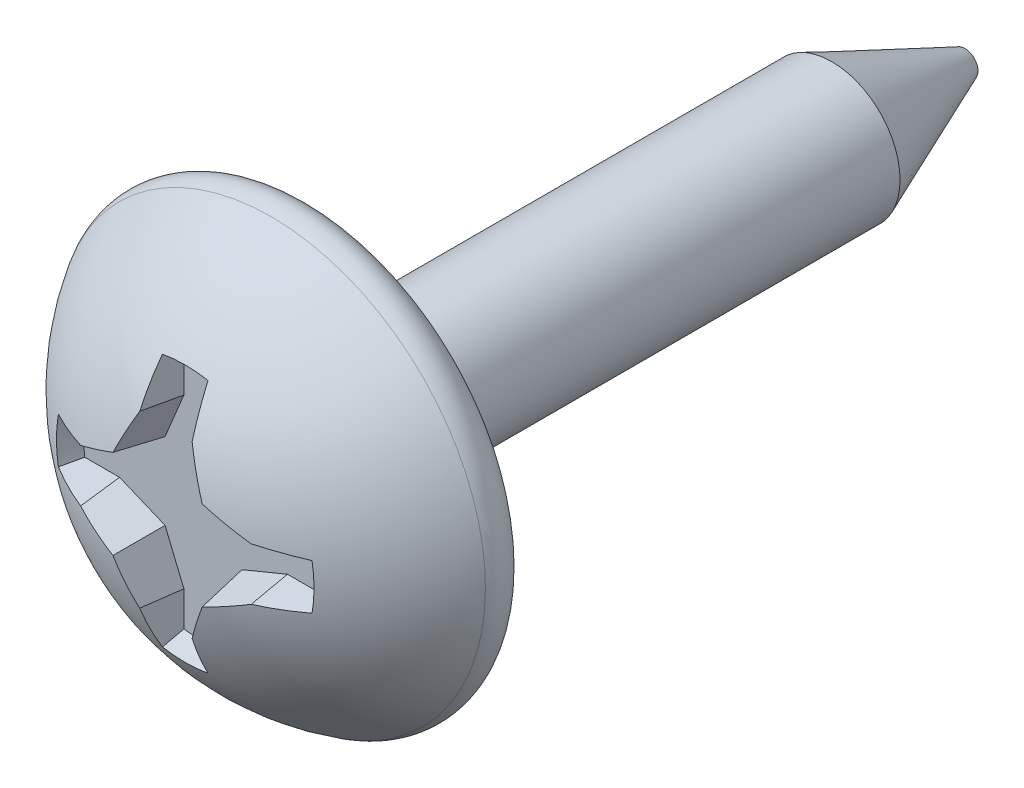
ISO-10303-21;
HEADER;
FILE_DESCRIPTION(('STEP AP214'),'2;1');
FILE_NAME('part.step','',(''),(''),'','','');
FILE_SCHEMA(('AUTOMOTIVE_DESIGN { 1 0 10303 214 1 1 1 1 }'));
ENDSEC;
DATA;
#1=APPLICATION_CONTEXT('core data for automotive mechanical design processes');
#2=APPLICATION_PROTOCOL_DEFINITION('international standard','automotive_design',2000,#1);
#3=PRODUCT_CONTEXT('',#1,'mechanical');
#4=PRODUCT('Part','Part','',(#3));
#5=PRODUCT_RELATED_PRODUCT_CATEGORY('part','',(#4));
#6=PRODUCT_DEFINITION_FORMATION('','',#4);
#7=PRODUCT_DEFINITION_CONTEXT('part definition',#1,'design');
#8=PRODUCT_DEFINITION('design','',#6,#7);
#9=PRODUCT_DEFINITION_SHAPE('','',#8);
#10=(LENGTH_UNIT() NAMED_UNIT(*) SI_UNIT(.MILLI.,.METRE.));
#11=(NAMED_UNIT(*) PLANE_ANGLE_UNIT() SI_UNIT($,.RADIAN.));
#12=(NAMED_UNIT(*) SI_UNIT($,.STERADIAN.) SOLID_ANGLE_UNIT());
#13=UNCERTAINTY_MEASURE_WITH_UNIT(LENGTH_MEASURE(1.E-05),#10,'distance_accuracy_value','');
#14=(GEOMETRIC_REPRESENTATION_CONTEXT(3) GLOBAL_UNCERTAINTY_ASSIGNED_CONTEXT((#13)) GLOBAL_UNIT_ASSIGNED_CONTEXT((#10,
#11,#12)) REPRESENTATION_CONTEXT('',''));
#15=CARTESIAN_POINT('',(0.,0.,0.));
#16=DIRECTION('',(0.,0.,1.));
#17=DIRECTION('',(1.,0.,0.));
#18=AXIS2_PLACEMENT_3D('',#15,#16,#17);
#19=CARTESIAN_POINT('',(0.,0.,0.));
#20=DIRECTION('',(0.,0.,-1.));
#21=DIRECTION('',(-1.,0.,0.));
#22=AXIS2_PLACEMENT_3D('',#19,#20,#21);
#23=CYLINDRICAL_SURFACE('',#22,0.662570209841312);
#24=CARTESIAN_POINT('',(0.,0.,0.));
#25=DIRECTION('',(0.,0.,-1.));
#26=DIRECTION('',(-1.,0.,0.));
#27=AXIS2_PLACEMENT_3D('',#24,#25,#26);
#28=CIRCLE('',#27,0.662570209841312);
#29=CARTESIAN_POINT('',(-0.662570209841312,0.,0.));
#30=VERTEX_POINT('',#29);
#31=EDGE_CURVE('E700',#30,#30,#28,.T.);
#32=ORIENTED_EDGE('',*,*,#31,.T.);
#33=EDGE_LOOP('',(#32));
#34=FACE_BOUND('',#33,.T.);
#35=CARTESIAN_POINT('',(0.,0.,-5.05701913579807));
#36=DIRECTION('',(0.,0.,1.));
#37=DIRECTION('',(1.,0.,0.));
#38=AXIS2_PLACEMENT_3D('',#35,#36,#37);
#39=CIRCLE('',#38,0.662570209841312);
#40=CARTESIAN_POINT('',(0.662570209841312,0.,-5.05701913579807));
#41=VERTEX_POINT('',#40);
#42=EDGE_CURVE('E696',#41,#41,#39,.T.);
#43=ORIENTED_EDGE('',*,*,#42,.T.);
#44=EDGE_LOOP('',(#43));
#45=FACE_BOUND('',#44,.T.);
#46=ADVANCED_FACE('F34',(#34,#45),#23,.T.);
#47=CARTESIAN_POINT('',(0.,0.,0.));
#48=DIRECTION('',(0.,0.,1.));
#49=DIRECTION('',(1.,0.,0.));
#50=AXIS2_PLACEMENT_3D('',#47,#48,#49);
#51=PLANE('',#50);
#52=ORIENTED_EDGE('',*,*,#31,.F.);
#53=EDGE_LOOP('',(#52));
#54=FACE_BOUND('',#53,.T.);
#55=CARTESIAN_POINT('',(0.,0.,0.));
#56=DIRECTION('',(0.,0.,-1.));
#57=DIRECTION('',(-1.,0.,0.));
#58=AXIS2_PLACEMENT_3D('',#55,#56,#57);
#59=CIRCLE('',#58,1.86081851094921);
#60=CARTESIAN_POINT('',(-1.86081851094921,0.,0.));
#61=VERTEX_POINT('',#60);
#62=EDGE_CURVE('E704',#61,#61,#59,.T.);
#63=ORIENTED_EDGE('',*,*,#62,.T.);
#64=EDGE_LOOP('',(#63));
#65=FACE_BOUND('',#64,.T.);
#66=ADVANCED_FACE('F269',(#54,#65),#51,.F.);
#67=CARTESIAN_POINT('',(0.,0.,0.260081489050793));
#68=DIRECTION('',(0.,0.,-1.));
#69=DIRECTION('',(-1.,0.,0.));
#70=AXIS2_PLACEMENT_3D('',#67,#68,#69);
#71=TOROIDAL_SURFACE('',#70,1.86081851094921,0.260081489050793);
#72=CARTESIAN_POINT('',(0.,0.,0.3937));
#73=DIRECTION('',(0.,0.,-1.));
#74=DIRECTION('',(-1.,0.,0.));
#75=AXIS2_PLACEMENT_3D('',#72,#73,#74);
#76=CIRCLE('',#75,2.08395182195094);
#77=CARTESIAN_POINT('',(-2.08395182195094,0.,0.3937));
#78=VERTEX_POINT('',#77);
#79=EDGE_CURVE('E391',#78,#78,#76,.T.);
#80=ORIENTED_EDGE('',*,*,#79,.T.);
#81=EDGE_LOOP('',(#80));
#82=FACE_BOUND('',#81,.T.);
#83=ORIENTED_EDGE('',*,*,#62,.F.);
#84=EDGE_LOOP('',(#83));
#85=FACE_BOUND('',#84,.T.);
#86=ADVANCED_FACE('F275',(#82,#85),#71,.T.);
#87=CARTESIAN_POINT('',(0.,0.,-0.854229043354766));
#88=DIRECTION('',(0.,0.,-1.));
#89=DIRECTION('',(0.,1.,0.));
#90=AXIS2_PLACEMENT_3D('',#87,#88,#89);
#91=SPHERICAL_SURFACE('',#90,2.42902904335477);
#92=CARTESIAN_POINT('',(0.141128825480216,0.,-0.829344223666908));
#93=DIRECTION('',(0.984807753012208,0.,0.173648177666931));
#94=DIRECTION('',(0.173648177666931,0.,-0.984807753012208));
#95=AXIS2_PLACEMENT_3D('',#92,#93,#94);
#96=CIRCLE('',#95,2.4247980315541);
#97=CARTESIAN_POINT('',(-0.254594202661198,0.828468542971583,1.41491259143554));
#98=VERTEX_POINT('',#97);
#99=CARTESIAN_POINT('',(-0.221519219927965,1.2321535141074,1.22733504317638));
#100=VERTEX_POINT('',#99);
#101=EDGE_CURVE('E11',#98,#100,#96,.F.);
#102=ORIENTED_EDGE('',*,*,#101,.T.);
#103=CARTESIAN_POINT('',(0.,0.,1.22733504317638));
#104=DIRECTION('',(0.,0.,-1.));
#105=DIRECTION('',(-1.,0.,0.));
#106=AXIS2_PLACEMENT_3D('',#103,#104,#105);
#107=CIRCLE('',#106,1.25190776302598);
#108=CARTESIAN_POINT('',(0.221519219927961,1.23215351410741,1.22733504317638));
#109=VERTEX_POINT('',#108);
#110=EDGE_CURVE('E488',#100,#109,#107,.T.);
#111=ORIENTED_EDGE('',*,*,#110,.T.);
#112=CARTESIAN_POINT('',(-0.141128825480217,0.,-0.829344223666908));
#113=DIRECTION('',(-0.984807753012208,0.,0.173648177666931));
#114=DIRECTION('',(0.173648177666931,0.,0.984807753012208));
#115=AXIS2_PLACEMENT_3D('',#112,#113,#114);
#116=CIRCLE('',#115,2.4247980315541);
#117=CARTESIAN_POINT('',(0.254594202661195,0.828468542971584,1.41491259143554));
#118=VERTEX_POINT('',#117);
#119=EDGE_CURVE('E53',#109,#118,#116,.F.);
#120=ORIENTED_EDGE('',*,*,#119,.T.);
#121=CARTESIAN_POINT('',(0.136324838861879,0.0564675971449169,-0.880247313471373));
#122=DIRECTION('',(-0.90984372646641,-0.376869611142463,0.173648177666931));
#123=DIRECTION('',(0.38268343236509,-0.923879532511287,0.));
#124=AXIS2_PLACEMENT_3D('',#121,#122,#123);
#125=CIRCLE('',#124,2.42440345072001);
#126=CARTESIAN_POINT('',(0.433636305459428,0.433636305459428,1.49611161336629));
#127=VERTEX_POINT('',#126);
#128=EDGE_CURVE('E487',#118,#127,#125,.F.);
#129=ORIENTED_EDGE('',*,*,#128,.T.);
#130=CARTESIAN_POINT('',(0.0564675971449167,0.136324838861878,-0.880247313471373));
#131=DIRECTION('',(-0.376869611142463,-0.90984372646641,0.173648177666931));
#132=DIRECTION('',(0.923879532511287,-0.382683432365089,0.));
#133=AXIS2_PLACEMENT_3D('',#130,#131,#132);
#134=CIRCLE('',#133,2.42440345072001);
#135=CARTESIAN_POINT('',(0.828468542971584,0.254594202661195,1.41491259143554));
#136=VERTEX_POINT('',#135);
#137=EDGE_CURVE('E485',#127,#136,#134,.F.);
#138=ORIENTED_EDGE('',*,*,#137,.T.);
#139=CARTESIAN_POINT('',(0.,-0.141128825480216,-0.829344223666908));
#140=DIRECTION('',(0.,-0.984807753012208,0.173648177666931));
#141=DIRECTION('',(0.,-0.173648177666931,-0.984807753012208));
#142=AXIS2_PLACEMENT_3D('',#139,#140,#141);
#143=CIRCLE('',#142,2.4247980315541);
#144=CARTESIAN_POINT('',(1.23215351410741,0.221519219927961,1.22733504317638));
#145=VERTEX_POINT('',#144);
#146=EDGE_CURVE('E390',#136,#145,#143,.F.);
#147=ORIENTED_EDGE('',*,*,#146,.T.);
#148=CARTESIAN_POINT('',(0.,0.,1.22733504317638));
#149=DIRECTION('',(0.,0.,-1.));
#150=DIRECTION('',(-1.,0.,0.));
#151=AXIS2_PLACEMENT_3D('',#148,#149,#150);
#152=CIRCLE('',#151,1.25190776302598);
#153=CARTESIAN_POINT('',(1.23215351410741,-0.221519219927948,1.22733504317638));
#154=VERTEX_POINT('',#153);
#155=EDGE_CURVE('E388',#145,#154,#152,.T.);
#156=ORIENTED_EDGE('',*,*,#155,.T.);
#157=CARTESIAN_POINT('',(0.,0.141128825480217,-0.829344223666908));
#158=DIRECTION('',(0.,0.984807753012208,0.173648177666931));
#159=DIRECTION('',(0.,-0.173648177666931,0.984807753012208));
#160=AXIS2_PLACEMENT_3D('',#157,#158,#159);
#161=CIRCLE('',#160,2.4247980315541);
#162=CARTESIAN_POINT('',(0.828468542971587,-0.254594202661186,1.41491259143554));
#163=VERTEX_POINT('',#162);
#164=EDGE_CURVE('E193',#154,#163,#161,.F.);
#165=ORIENTED_EDGE('',*,*,#164,.T.);
#166=CARTESIAN_POINT('',(0.0564675971449183,-0.136324838861878,-0.880247313471373));
#167=DIRECTION('',(-0.376869611142473,0.909843726466406,0.173648177666931));
#168=DIRECTION('',(-0.923879532511283,-0.3826834323651,0.));
#169=AXIS2_PLACEMENT_3D('',#166,#167,#168);
#170=CIRCLE('',#169,2.42440345072001);
#171=CARTESIAN_POINT('',(0.433636305459433,-0.433636305459424,1.49611161336629));
#172=VERTEX_POINT('',#171);
#173=EDGE_CURVE('E606',#163,#172,#170,.F.);
#174=ORIENTED_EDGE('',*,*,#173,.T.);
#175=CARTESIAN_POINT('',(0.136324838861879,-0.0564675971449154,-0.880247313471373));
#176=DIRECTION('',(-0.909843726466414,0.376869611142453,0.173648177666931));
#177=DIRECTION('',(-0.38268343236508,-0.923879532511291,0.));
#178=AXIS2_PLACEMENT_3D('',#175,#176,#177);
#179=CIRCLE('',#178,2.42440345072001);
#180=CARTESIAN_POINT('',(0.254594202661204,-0.828468542971582,1.41491259143554));
#181=VERTEX_POINT('',#180);
#182=EDGE_CURVE('E604',#172,#181,#179,.F.);
#183=ORIENTED_EDGE('',*,*,#182,.T.);
#184=CARTESIAN_POINT('',(-0.141128825480216,0.,-0.829344223666908));
#185=DIRECTION('',(-0.984807753012208,0.,0.173648177666931));
#186=DIRECTION('',(0.173648177666931,0.,0.984807753012208));
#187=AXIS2_PLACEMENT_3D('',#184,#185,#186);
#188=CIRCLE('',#187,2.4247980315541);
#189=CARTESIAN_POINT('',(0.221519219927974,-1.2321535141074,1.22733504317638));
#190=VERTEX_POINT('',#189);
#191=EDGE_CURVE('E215',#181,#190,#188,.F.);
#192=ORIENTED_EDGE('',*,*,#191,.T.);
#193=CARTESIAN_POINT('',(0.,0.,1.22733504317638));
#194=DIRECTION('',(0.,0.,-1.));
#195=DIRECTION('',(-1.,0.,0.));
#196=AXIS2_PLACEMENT_3D('',#193,#194,#195);
#197=CIRCLE('',#196,1.25190776302598);
#198=CARTESIAN_POINT('',(-0.221519219927952,-1.23215351410741,1.22733504317638));
#199=VERTEX_POINT('',#198);
#200=EDGE_CURVE('E371',#190,#199,#197,.T.);
#201=ORIENTED_EDGE('',*,*,#200,.T.);
#202=CARTESIAN_POINT('',(0.141128825480217,0.,-0.829344223666908));
#203=DIRECTION('',(0.984807753012208,0.,0.173648177666931));
#204=DIRECTION('',(0.173648177666931,0.,-0.984807753012208));
#205=AXIS2_PLACEMENT_3D('',#202,#203,#204);
#206=CIRCLE('',#205,2.4247980315541);
#207=CARTESIAN_POINT('',(-0.254594202661189,-0.828468542971586,1.41491259143554));
#208=VERTEX_POINT('',#207);
#209=EDGE_CURVE('E367',#199,#208,#206,.F.);
#210=ORIENTED_EDGE('',*,*,#209,.T.);
#211=CARTESIAN_POINT('',(-0.136324838861878,-0.0564675971449178,-0.880247313471373));
#212=DIRECTION('',(0.909843726466407,0.37686961114247,0.173648177666931));
#213=DIRECTION('',(-0.382683432365096,0.923879532511284,0.));
#214=AXIS2_PLACEMENT_3D('',#211,#212,#213);
#215=CIRCLE('',#214,2.42440345072001);
#216=CARTESIAN_POINT('',(-0.433636305459425,-0.433636305459431,1.49611161336629));
#217=VERTEX_POINT('',#216);
#218=EDGE_CURVE('E370',#208,#217,#215,.F.);
#219=ORIENTED_EDGE('',*,*,#218,.T.);
#220=CARTESIAN_POINT('',(-0.0564675971449158,-0.136324838861879,-0.880247313471373));
#221=DIRECTION('',(0.376869611142457,0.909843726466413,0.173648177666931));
#222=DIRECTION('',(-0.92387953251129,0.382683432365083,0.));
#223=AXIS2_PLACEMENT_3D('',#220,#221,#222);
#224=CIRCLE('',#223,2.42440345072001);
#225=CARTESIAN_POINT('',(-0.828468542971582,-0.254594202661201,1.41491259143554));
#226=VERTEX_POINT('',#225);
#227=EDGE_CURVE('E374',#217,#226,#224,.F.);
#228=ORIENTED_EDGE('',*,*,#227,.T.);
#229=CARTESIAN_POINT('',(0.,0.141128825480216,-0.829344223666908));
#230=DIRECTION('',(0.,0.984807753012208,0.173648177666931));
#231=DIRECTION('',(0.,-0.173648177666931,0.984807753012208));
#232=AXIS2_PLACEMENT_3D('',#229,#230,#231);
#233=CIRCLE('',#232,2.4247980315541);
#234=CARTESIAN_POINT('',(-1.2321535141074,-0.22151921992797,1.22733504317638));
#235=VERTEX_POINT('',#234);
#236=EDGE_CURVE('E376',#226,#235,#233,.F.);
#237=ORIENTED_EDGE('',*,*,#236,.T.);
#238=CARTESIAN_POINT('',(0.,0.,1.22733504317638));
#239=DIRECTION('',(0.,0.,-1.));
#240=DIRECTION('',(-1.,0.,0.));
#241=AXIS2_PLACEMENT_3D('',#238,#239,#240);
#242=CIRCLE('',#241,1.25190776302598);
#243=CARTESIAN_POINT('',(-1.23215351410741,0.221519219927956,1.22733504317638));
#244=VERTEX_POINT('',#243);
#245=EDGE_CURVE('E378',#235,#244,#242,.T.);
#246=ORIENTED_EDGE('',*,*,#245,.T.);
#247=CARTESIAN_POINT('',(0.,-0.141128825480217,-0.829344223666908));
#248=DIRECTION('',(0.,-0.984807753012208,0.173648177666931));
#249=DIRECTION('',(0.,-0.173648177666931,-0.984807753012208));
#250=AXIS2_PLACEMENT_3D('',#247,#248,#249);
#251=CIRCLE('',#250,2.4247980315541);
#252=CARTESIAN_POINT('',(-0.828468542971585,0.254594202661192,1.41491259143554));
#253=VERTEX_POINT('',#252);
#254=EDGE_CURVE('E318',#244,#253,#251,.F.);
#255=ORIENTED_EDGE('',*,*,#254,.T.);
#256=CARTESIAN_POINT('',(-0.0564675971449173,0.136324838861878,-0.880247313471373));
#257=DIRECTION('',(0.376869611142467,-0.909843726466408,0.173648177666931));
#258=DIRECTION('',(0.923879532511285,0.382683432365093,0.));
#259=AXIS2_PLACEMENT_3D('',#256,#257,#258);
#260=CIRCLE('',#259,2.42440345072001);
#261=CARTESIAN_POINT('',(-0.43363630545943,0.433636305459427,1.49611161336629));
#262=VERTEX_POINT('',#261);
#263=EDGE_CURVE('E382',#253,#262,#260,.F.);
#264=ORIENTED_EDGE('',*,*,#263,.T.);
#265=CARTESIAN_POINT('',(-0.136324838861879,0.0564675971449163,-0.880247313471373));
#266=DIRECTION('',(0.909843726466411,-0.37686961114246,0.173648177666931));
#267=DIRECTION('',(0.382683432365086,0.923879532511288,0.));
#268=AXIS2_PLACEMENT_3D('',#265,#266,#267);
#269=CIRCLE('',#268,2.42440345072001);
#270=EDGE_CURVE('E44',#262,#98,#269,.F.);
#271=ORIENTED_EDGE('',*,*,#270,.T.);
#272=EDGE_LOOP('',(#102,#111,#120,#129,#138,#147,#156,#165,#174,#183,#192,#201,#210,#219,#228,
#237,#246,#255,#264,#271));
#273=FACE_BOUND('',#272,.T.);
#274=ORIENTED_EDGE('',*,*,#79,.F.);
#275=EDGE_LOOP('',(#274));
#276=FACE_BOUND('',#275,.T.);
#277=ADVANCED_FACE('F284',(#273,#276),#91,.T.);
#278=CARTESIAN_POINT('',(0.,0.,-4.01980106959744));
#279=DIRECTION('',(0.,0.,1.));
#280=DIRECTION('',(1.,0.,0.));
#281=AXIS2_PLACEMENT_3D('',#278,#279,#280);
#282=CONICAL_SURFACE('',#281,1.0922,0.392699081698718);
#283=CARTESIAN_POINT('',(0.,0.,-6.34999999999999));
#284=DIRECTION('',(0.,0.,1.));
#285=DIRECTION('',(1.,0.,0.));
#286=AXIS2_PLACEMENT_3D('',#283,#284,#285);
#287=CIRCLE('',#286,0.127);
#288=CARTESIAN_POINT('',(0.127,0.,-6.35));
#289=VERTEX_POINT('',#288);
#290=EDGE_CURVE('E411',#289,#289,#287,.T.);
#291=CARTESIAN_POINT('',(0.662570209841312,0.,-5.05701913579807));
#292=CARTESIAN_POINT('',(0.656991353488798,0.,-5.07048768646684));
#293=CARTESIAN_POINT('',(0.651412497136284,0.,-5.08395623713561));
#294=CARTESIAN_POINT('',(0.640254784431257,0.,-5.11089333847315));
#295=CARTESIAN_POINT('',(0.634675928078744,0.,-5.12436188914192));
#296=CARTESIAN_POINT('',(0.623518215373716,0.,-5.15129899047946));
#297=CARTESIAN_POINT('',(0.617939359021203,0.,-5.16476754114823));
#298=CARTESIAN_POINT('',(0.606781646316175,0.,-5.19170464248577));
#299=CARTESIAN_POINT('',(0.601202789963661,0.,-5.20517319315454));
#300=CARTESIAN_POINT('',(0.590045077258634,0.,-5.23211029449208));
#301=CARTESIAN_POINT('',(0.584466220906121,0.,-5.24557884516085));
#302=CARTESIAN_POINT('',(0.573308508201093,0.,-5.27251594649839));
#303=CARTESIAN_POINT('',(0.56772965184858,0.,-5.28598449716716));
#304=CARTESIAN_POINT('',(0.556571939143552,0.,-5.3129215985047));
#305=CARTESIAN_POINT('',(0.550993082791039,0.,-5.32639014917347));
#306=CARTESIAN_POINT('',(0.539835370086011,0.,-5.35332725051101));
#307=CARTESIAN_POINT('',(0.534256513733498,0.,-5.36679580117978));
#308=CARTESIAN_POINT('',(0.52309880102847,0.,-5.39373290251732));
#309=CARTESIAN_POINT('',(0.517519944675957,0.,-5.40720145318609));
#310=CARTESIAN_POINT('',(0.506362231970929,0.,-5.43413855452363));
#311=CARTESIAN_POINT('',(0.500783375618416,0.,-5.4476071051924));
#312=CARTESIAN_POINT('',(0.489625662913388,0.,-5.47454420652994));
#313=CARTESIAN_POINT('',(0.484046806560874,0.,-5.48801275719871));
#314=CARTESIAN_POINT('',(0.472889093855847,0.,-5.51494985853625));
#315=CARTESIAN_POINT('',(0.467310237503334,0.,-5.52841840920502));
#316=CARTESIAN_POINT('',(0.456152524798306,0.,-5.55535551054256));
#317=CARTESIAN_POINT('',(0.450573668445793,0.,-5.56882406121133));
#318=CARTESIAN_POINT('',(0.439415955740765,0.,-5.59576116254887));
#319=CARTESIAN_POINT('',(0.433837099388252,0.,-5.60922971321764));
#320=CARTESIAN_POINT('',(0.422679386683224,0.,-5.63616681455518));
#321=CARTESIAN_POINT('',(0.417100530330711,0.,-5.64963536522395));
#322=CARTESIAN_POINT('',(0.405942817625683,0.,-5.67657246656149));
#323=CARTESIAN_POINT('',(0.40036396127317,0.,-5.69004101723026));
#324=CARTESIAN_POINT('',(0.389206248568142,0.,-5.7169781185678));
#325=CARTESIAN_POINT('',(0.383627392215629,0.,-5.73044666923657));
#326=CARTESIAN_POINT('',(0.372469679510601,0.,-5.75738377057411));
#327=CARTESIAN_POINT('',(0.366890823158088,0.,-5.77085232124288));
#328=CARTESIAN_POINT('',(0.35573311045306,0.,-5.79778942258042));
#329=CARTESIAN_POINT('',(0.350154254100546,0.,-5.81125797324919));
#330=CARTESIAN_POINT('',(0.338996541395519,0.,-5.83819507458673));
#331=CARTESIAN_POINT('',(0.333417685043006,0.,-5.8516636252555));
#332=CARTESIAN_POINT('',(0.322259972337978,0.,-5.87860072659304));
#333=CARTESIAN_POINT('',(0.316681115985465,0.,-5.89206927726181));
#334=CARTESIAN_POINT('',(0.305523403280437,0.,-5.91900637859935));
#335=CARTESIAN_POINT('',(0.299944546927924,0.,-5.93247492926812));
#336=CARTESIAN_POINT('',(0.288786834222896,0.,-5.95941203060566));
#337=CARTESIAN_POINT('',(0.283207977870383,0.,-5.97288058127443));
#338=CARTESIAN_POINT('',(0.272050265165355,0.,-5.99981768261198));
#339=CARTESIAN_POINT('',(0.266471408812841,0.,-6.01328623328074));
#340=CARTESIAN_POINT('',(0.255313696107814,0.,-6.04022333461828));
#341=CARTESIAN_POINT('',(0.249734839755301,0.,-6.05369188528705));
#342=CARTESIAN_POINT('',(0.238577127050273,0.,-6.08062898662459));
#343=CARTESIAN_POINT('',(0.232998270697759,0.,-6.09409753729336));
#344=CARTESIAN_POINT('',(0.221840557992732,0.,-6.1210346386309));
#345=CARTESIAN_POINT('',(0.216261701640219,0.,-6.13450318929967));
#346=CARTESIAN_POINT('',(0.205103988935191,0.,-6.16144029063721));
#347=CARTESIAN_POINT('',(0.199525132582678,0.,-6.17490884130599));
#348=CARTESIAN_POINT('',(0.18836741987765,0.,-6.20184594264352));
#349=CARTESIAN_POINT('',(0.182788563525136,0.,-6.2153144933123));
#350=CARTESIAN_POINT('',(0.171630850820109,0.,-6.24225159464984));
#351=CARTESIAN_POINT('',(0.166051994467595,0.,-6.25572014531861));
#352=CARTESIAN_POINT('',(0.154894281762568,0.,-6.28265724665615));
#353=CARTESIAN_POINT('',(0.149315425410055,0.,-6.29612579732491));
#354=CARTESIAN_POINT('',(0.138157712705027,0.,-6.32306289866245));
#355=CARTESIAN_POINT('',(0.132578856352514,0.,-6.33653144933123));
#356=CARTESIAN_POINT('',(0.127,0.,-6.35));
#357=B_SPLINE_CURVE_WITH_KNOTS('',3,(#291,#292,#293,#294,#295,#296,#297,#298,#299,#300,#301,
#302,#303,#304,#305,#306,#307,#308,#309,#310,#311,#312,#313,#314,#315,#316,#317,#318,#319,#320,
#321,#322,#323,#324,#325,#326,#327,#328,#329,#330,#331,#332,#333,#334,#335,#336,#337,#338,#339,
#340,#341,#342,#343,#344,#345,#346,#347,#348,#349,#350,#351,#352,#353,#354,#355,#356),
.UNSPECIFIED.,.F.,.F.,(4,2,2,2,2,2,2,2,2,2,2,2,2,2,2,2,2,2,2,2,2,2,2,2,2,2,2,2,2,2,2,2,4),(0.,
0.0437347625793582,0.087469525158717,0.131204287738076,0.174939050317434,0.218673812896793,
0.262408575476152,0.306143338055511,0.34987810063487,0.393612863214228,0.437347625793587,
0.481082388372945,0.524817150952304,0.568551913531662,0.612286676111021,0.65602143869038,
0.699756201269738,0.743490963849097,0.787225726428456,0.830960489007814,0.874695251587173,
0.918430014166532,0.962164776745891,1.00589953932525,1.04963430190461,1.09336906448397,
1.13710382706332,1.18083858964268,1.22457335222204,1.2683081148014,1.31204287738076,
1.35577763996012,1.39951240253948),.UNSPECIFIED.);
#358=EDGE_CURVE('BSEAM287',#41,#289,#357,.T.);
#359=ORIENTED_EDGE('',*,*,#42,.F.);
#360=ORIENTED_EDGE('',*,*,#290,.T.);
#361=ORIENTED_EDGE('',*,*,#358,.T.);
#362=ORIENTED_EDGE('',*,*,#358,.F.);
#363=EDGE_LOOP('',(#359,#361,#360,#362));
#364=FACE_BOUND('',#363,.T.);
#365=ADVANCED_FACE('F287',(#364),#282,.T.);
#366=CARTESIAN_POINT('',(0.,0.,-6.34999999999999));
#367=DIRECTION('',(0.,0.,-1.));
#368=DIRECTION('',(-1.,0.,0.));
#369=AXIS2_PLACEMENT_3D('',#366,#367,#368);
#370=PLANE('',#369);
#371=ORIENTED_EDGE('',*,*,#290,.F.);
#372=EDGE_LOOP('',(#371));
#373=FACE_BOUND('',#372,.T.);
#374=ADVANCED_FACE('F282',(#373),#370,.T.);
#375=CARTESIAN_POINT('',(0.,0.,1.5748));
#376=DIRECTION('',(0.,0.,1.));
#377=DIRECTION('',(1.,0.,0.));
#378=AXIS2_PLACEMENT_3D('',#375,#376,#377);
#379=CONICAL_SURFACE('',#378,1.41393333333333,0.436332312998583);
#380=ORIENTED_EDGE('',*,*,#110,.F.);
#381=CARTESIAN_POINT('',(-0.0567655589097211,0.814230108589913,0.292970600728164));
#382=CARTESIAN_POINT('',(-0.0704563797187253,0.849560680091315,0.370615103877912));
#383=CARTESIAN_POINT('',(-0.0841608874473927,0.884714488239667,0.448337229406313));
#384=CARTESIAN_POINT('',(-0.111590793644833,0.954749429859741,0.603899957737671));
#385=CARTESIAN_POINT('',(-0.125316191970339,0.989630565191458,0.681740559728125));
#386=CARTESIAN_POINT('',(-0.152781531160089,1.05920136114441,0.837504238544587));
#387=CARTESIAN_POINT('',(-0.166521471968835,1.09389102249324,0.915427315055852));
#388=CARTESIAN_POINT('',(-0.194012697128111,1.16312244787804,1.07133780050067));
#389=CARTESIAN_POINT('',(-0.207763981554202,1.19766421091919,1.14932520986275));
#390=CARTESIAN_POINT('',(-0.221519219927964,1.23215351410742,1.22733504317637));
#391=B_SPLINE_CURVE_WITH_KNOTS('',3,(#381,#382,#383,#384,#385,#386,#387,#388,#389,#390),
.UNSPECIFIED.,.F.,.F.,(4,2,2,2,4),(0.,0.259188802144362,0.518375834725883,0.777561881728411,
1.03674966936922),.UNSPECIFIED.);
#392=CARTESIAN_POINT('',(-0.190226756926774,1.15357370136408,1.04986666666667));
#393=VERTEX_POINT('',#392);
#394=EDGE_CURVE('E330',#393,#100,#391,.T.);
#395=ORIENTED_EDGE('',*,*,#394,.F.);
#396=CARTESIAN_POINT('',(0.,0.,1.04986666666667));
#397=DIRECTION('',(0.,0.,1.));
#398=DIRECTION('',(1.,0.,0.));
#399=AXIS2_PLACEMENT_3D('',#396,#397,#398);
#400=CIRCLE('',#399,1.16915289997917);
#401=CARTESIAN_POINT('',(0.19022675692677,1.15357370136408,1.04986666666667));
#402=VERTEX_POINT('',#401);
#403=EDGE_CURVE('E385',#402,#393,#400,.T.);
#404=ORIENTED_EDGE('',*,*,#403,.F.);
#405=CARTESIAN_POINT('',(0.0990141708359296,0.922637835089648,0.532574385449372));
#406=CARTESIAN_POINT('',(0.116954052360132,0.968415073311771,0.634316509383676));
#407=CARTESIAN_POINT('',(0.134909635736079,1.01398728041228,0.736147682944313));
#408=CARTESIAN_POINT('',(0.170844206107649,1.10482344058561,0.939942758588369));
#409=CARTESIAN_POINT('',(0.188823192990387,1.15008739513874,1.04190666003159));
#410=CARTESIAN_POINT('',(0.224796691352881,1.24040916710332,1.24592250728285));
#411=CARTESIAN_POINT('',(0.242791202788023,1.28546698510482,1.34797445283787));
#412=CARTESIAN_POINT('',(0.278792044422402,1.37542713542571,1.55214537148986));
#413=CARTESIAN_POINT('',(0.296798374676748,1.42032946701388,1.65426434489937));
#414=CARTESIAN_POINT('',(0.314808651172271,1.46517910460196,1.75640569855471));
#415=B_SPLINE_CURVE_WITH_KNOTS('',3,(#405,#406,#407,#408,#409,#410,#411,#412,#413,#414),
.UNSPECIFIED.,.F.,.F.,(4,2,2,2,4),(0.,0.338997296699866,0.677992964293807,1.01698766095126,
1.35598394969396),.UNSPECIFIED.);
#416=EDGE_CURVE('E399',#402,#109,#415,.T.);
#417=ORIENTED_EDGE('',*,*,#416,.T.);
#418=EDGE_LOOP('',(#380,#395,#404,#417));
#419=FACE_BOUND('',#418,.T.);
#420=ADVANCED_FACE('F296',(#419),#379,.F.);
#421=CARTESIAN_POINT('',(0.282786666666667,0.,1.5748));
#422=DIRECTION('',(-0.984807753012208,0.,0.173648177666931));
#423=DIRECTION('',(0.173648177666931,0.,0.984807753012208));
#424=AXIS2_PLACEMENT_3D('',#421,#422,#423);
#425=PLANE('',#424);
#426=ORIENTED_EDGE('',*,*,#416,.F.);
#427=DIRECTION('',(0.,-1.,0.));
#428=VECTOR('',#427,1.);
#429=CARTESIAN_POINT('',(0.19022675692677,0.,1.04986666666667));
#430=LINE('',#429,#428);
#431=CARTESIAN_POINT('',(0.19022675692677,0.815665061958368,1.04986666666667));
#432=VERTEX_POINT('',#431);
#433=EDGE_CURVE('E422',#432,#402,#430,.F.);
#434=ORIENTED_EDGE('',*,*,#433,.F.);
#435=DIRECTION('',(0.173544683499998,0.0345201838411381,0.984220808424847));
#436=VECTOR('',#435,1.);
#437=CARTESIAN_POINT('',(0.277789886621204,0.83308245138106,1.54646185217154));
#438=LINE('',#437,#436);
#439=EDGE_CURVE('E397',#432,#118,#438,.T.);
#440=ORIENTED_EDGE('',*,*,#439,.T.);
#441=ORIENTED_EDGE('',*,*,#119,.F.);
#442=EDGE_LOOP('',(#426,#434,#440,#441));
#443=FACE_BOUND('',#442,.T.);
#444=ADVANCED_FACE('F234',(#443),#425,.T.);
#445=CARTESIAN_POINT('',(0.536264047740044,0.222127841587019,1.5748));
#446=DIRECTION('',(-0.90984372646641,-0.376869611142463,0.173648177666931));
#447=DIRECTION('',(0.38268343236509,-0.923879532511287,0.));
#448=AXIS2_PLACEMENT_3D('',#445,#446,#447);
#449=PLANE('',#448);
#450=ORIENTED_EDGE('',*,*,#439,.F.);
#451=DIRECTION('',(0.38268343236509,-0.923879532511287,0.));
#452=VECTOR('',#451,1.);
#453=CARTESIAN_POINT('',(0.45074984160026,0.186706697628353,1.04986666666667));
#454=LINE('',#453,#452);
#455=CARTESIAN_POINT('',(0.373413395256704,0.373413395256705,1.04986666666667));
#456=VERTEX_POINT('',#455);
#457=EDGE_CURVE('E429',#456,#432,#454,.F.);
#458=ORIENTED_EDGE('',*,*,#457,.F.);
#459=DIRECTION('',(0.132562095018009,0.132562095018009,0.982270116581418));
#460=VECTOR('',#459,1.);
#461=CARTESIAN_POINT('',(0.441969131464488,0.441969131464488,1.55785691069529));
#462=LINE('',#461,#460);
#463=EDGE_CURVE('E400',#456,#127,#462,.T.);
#464=ORIENTED_EDGE('',*,*,#463,.T.);
#465=ORIENTED_EDGE('',*,*,#128,.F.);
#466=EDGE_LOOP('',(#450,#458,#464,#465));
#467=FACE_BOUND('',#466,.T.);
#468=ADVANCED_FACE('F230',(#467),#449,.T.);
#469=CARTESIAN_POINT('',(0.222127841587019,0.536264047740044,1.5748));
#470=DIRECTION('',(-0.376869611142463,-0.90984372646641,0.173648177666931));
#471=DIRECTION('',(0.923879532511287,-0.382683432365089,0.));
#472=AXIS2_PLACEMENT_3D('',#469,#470,#471);
#473=PLANE('',#472);
#474=ORIENTED_EDGE('',*,*,#463,.F.);
#475=DIRECTION('',(0.923879532511287,-0.382683432365089,0.));
#476=VECTOR('',#475,1.);
#477=CARTESIAN_POINT('',(0.186706697628352,0.450749841600261,1.04986666666667));
#478=LINE('',#477,#476);
#479=CARTESIAN_POINT('',(0.815665061958368,0.19022675692677,1.04986666666667));
#480=VERTEX_POINT('',#479);
#481=EDGE_CURVE('E431',#480,#456,#478,.F.);
#482=ORIENTED_EDGE('',*,*,#481,.F.);
#483=DIRECTION('',(0.0345201838411381,0.173544683499998,0.984220808424847));
#484=VECTOR('',#483,1.);
#485=CARTESIAN_POINT('',(0.834865679358879,0.286754779057557,1.59730428366066));
#486=LINE('',#485,#484);
#487=EDGE_CURVE('E403',#480,#136,#486,.T.);
#488=ORIENTED_EDGE('',*,*,#487,.T.);
#489=ORIENTED_EDGE('',*,*,#137,.F.);
#490=EDGE_LOOP('',(#474,#482,#488,#489));
#491=FACE_BOUND('',#490,.T.);
#492=ADVANCED_FACE('F233',(#491),#473,.T.);
#493=CARTESIAN_POINT('',(0.,0.282786666666667,1.5748));
#494=DIRECTION('',(0.,-0.984807753012208,0.173648177666931));
#495=DIRECTION('',(0.,-0.173648177666931,-0.984807753012208));
#496=AXIS2_PLACEMENT_3D('',#493,#494,#495);
#497=PLANE('',#496);
#498=ORIENTED_EDGE('',*,*,#487,.F.);
#499=DIRECTION('',(1.,0.,0.));
#500=VECTOR('',#499,1.);
#501=CARTESIAN_POINT('',(0.,0.19022675692677,1.04986666666667));
#502=LINE('',#501,#500);
#503=CARTESIAN_POINT('',(1.15357370136408,0.19022675692677,1.04986666666667));
#504=VERTEX_POINT('',#503);
#505=EDGE_CURVE('E185',#504,#480,#502,.F.);
#506=ORIENTED_EDGE('',*,*,#505,.F.);
#507=CARTESIAN_POINT('',(0.814230108589913,0.0567655589097183,0.292970600728164));
#508=CARTESIAN_POINT('',(0.849560680091314,0.0704563797187224,0.370615103877912));
#509=CARTESIAN_POINT('',(0.884714488239667,0.0841608874473896,0.448337229406313));
#510=CARTESIAN_POINT('',(0.954749429859741,0.111590793644829,0.603899957737671));
#511=CARTESIAN_POINT('',(0.989630565191459,0.125316191970335,0.681740559728125));
#512=CARTESIAN_POINT('',(1.05920136114441,0.152781531160085,0.837504238544587));
#513=CARTESIAN_POINT('',(1.09389102249324,0.166521471968831,0.915427315055852));
#514=CARTESIAN_POINT('',(1.16312244787804,0.194012697128107,1.07133780050067));
#515=CARTESIAN_POINT('',(1.19766421091919,0.207763981554198,1.14932520986275));
#516=CARTESIAN_POINT('',(1.23215351410742,0.22151921992796,1.22733504317637));
#517=B_SPLINE_CURVE_WITH_KNOTS('',3,(#507,#508,#509,#510,#511,#512,#513,#514,#515,#516),
.UNSPECIFIED.,.F.,.F.,(4,2,2,2,4),(0.,0.259188802144362,0.518375834725883,0.777561881728411,
1.03674966936922),.UNSPECIFIED.);
#518=EDGE_CURVE('E180',#504,#145,#517,.T.);
#519=ORIENTED_EDGE('',*,*,#518,.T.);
#520=ORIENTED_EDGE('',*,*,#146,.F.);
#521=EDGE_LOOP('',(#498,#506,#519,#520));
#522=FACE_BOUND('',#521,.T.);
#523=ADVANCED_FACE('F238',(#522),#497,.T.);
#524=CARTESIAN_POINT('',(0.,0.,1.5748));
#525=DIRECTION('',(0.,0.,1.));
#526=DIRECTION('',(1.,0.,0.));
#527=AXIS2_PLACEMENT_3D('',#524,#525,#526);
#528=CONICAL_SURFACE('',#527,1.41393333333333,0.436332312998583);
#529=ORIENTED_EDGE('',*,*,#518,.F.);
#530=CARTESIAN_POINT('',(0.,0.,1.04986666666667));
#531=DIRECTION('',(0.,0.,1.));
#532=DIRECTION('',(1.,0.,0.));
#533=AXIS2_PLACEMENT_3D('',#530,#531,#532);
#534=CIRCLE('',#533,1.16915289997917);
#535=CARTESIAN_POINT('',(1.15357370136408,-0.190226756926758,1.04986666666667));
#536=VERTEX_POINT('',#535);
#537=EDGE_CURVE('E175',#536,#504,#534,.T.);
#538=ORIENTED_EDGE('',*,*,#537,.F.);
#539=CARTESIAN_POINT('',(0.922637835089647,-0.0990141708359193,0.532574385449368));
#540=CARTESIAN_POINT('',(0.968415073311771,-0.116954052360121,0.634316509383673));
#541=CARTESIAN_POINT('',(1.01398728041228,-0.134909635736068,0.736147682944311));
#542=CARTESIAN_POINT('',(1.10482344058561,-0.170844206107637,0.939942758588369));
#543=CARTESIAN_POINT('',(1.15008739513874,-0.188823192990375,1.04190666003159));
#544=CARTESIAN_POINT('',(1.24040916710333,-0.224796691352868,1.24592250728285));
#545=CARTESIAN_POINT('',(1.28546698510482,-0.24279120278801,1.34797445283787));
#546=CARTESIAN_POINT('',(1.37542713542571,-0.278792044422388,1.55214537148987));
#547=CARTESIAN_POINT('',(1.42032946701389,-0.296798374676734,1.65426434489937));
#548=CARTESIAN_POINT('',(1.46517910460197,-0.314808651172256,1.75640569855472));
#549=B_SPLINE_CURVE_WITH_KNOTS('',3,(#539,#540,#541,#542,#543,#544,#545,#546,#547,#548),
.UNSPECIFIED.,.F.,.F.,(4,2,2,2,4),(0.,0.338997296699868,0.677992964293811,1.01698766095126,
1.35598394969397),.UNSPECIFIED.);
#550=EDGE_CURVE('E178',#536,#154,#549,.T.);
#551=ORIENTED_EDGE('',*,*,#550,.T.);
#552=ORIENTED_EDGE('',*,*,#155,.F.);
#553=EDGE_LOOP('',(#529,#538,#551,#552));
#554=FACE_BOUND('',#553,.T.);
#555=ADVANCED_FACE('F177',(#554),#528,.F.);
#556=CARTESIAN_POINT('',(0.,0.,1.04986666666667));
#557=DIRECTION('',(0.,0.,1.));
#558=DIRECTION('',(1.,0.,0.));
#559=AXIS2_PLACEMENT_3D('',#556,#557,#558);
#560=PLANE('',#559);
#561=ORIENTED_EDGE('',*,*,#403,.T.);
#562=DIRECTION('',(0.,1.,0.));
#563=VECTOR('',#562,1.);
#564=CARTESIAN_POINT('',(-0.19022675692677,0.,1.04986666666667));
#565=LINE('',#564,#563);
#566=CARTESIAN_POINT('',(-0.190226756926773,0.815665061958368,1.04986666666667));
#567=VERTEX_POINT('',#566);
#568=EDGE_CURVE('E339',#393,#567,#565,.F.);
#569=ORIENTED_EDGE('',*,*,#568,.T.);
#570=DIRECTION('',(0.382683432365086,0.923879532511288,0.));
#571=VECTOR('',#570,1.);
#572=CARTESIAN_POINT('',(-0.450749841600261,0.186706697628351,1.04986666666667));
#573=LINE('',#572,#571);
#574=CARTESIAN_POINT('',(-0.373413395256706,0.373413395256703,1.04986666666667));
#575=VERTEX_POINT('',#574);
#576=EDGE_CURVE('E342',#567,#575,#573,.F.);
#577=ORIENTED_EDGE('',*,*,#576,.T.);
#578=DIRECTION('',(0.923879532511285,0.382683432365093,0.));
#579=VECTOR('',#578,1.);
#580=CARTESIAN_POINT('',(-0.186706697628354,0.45074984160026,1.04986666666667));
#581=LINE('',#580,#579);
#582=CARTESIAN_POINT('',(-0.815665061958369,0.190226756926767,1.04986666666667));
#583=VERTEX_POINT('',#582);
#584=EDGE_CURVE('E346',#575,#583,#581,.F.);
#585=ORIENTED_EDGE('',*,*,#584,.T.);
#586=DIRECTION('',(1.,0.,0.));
#587=VECTOR('',#586,1.);
#588=CARTESIAN_POINT('',(0.,0.19022675692677,1.04986666666667));
#589=LINE('',#588,#587);
#590=CARTESIAN_POINT('',(-1.15357370136408,0.190226756926766,1.04986666666667));
#591=VERTEX_POINT('',#590);
#592=EDGE_CURVE('E349',#583,#591,#589,.F.);
#593=ORIENTED_EDGE('',*,*,#592,.T.);
#594=CARTESIAN_POINT('',(0.,0.,1.04986666666667));
#595=DIRECTION('',(0.,0.,1.));
#596=DIRECTION('',(1.,0.,0.));
#597=AXIS2_PLACEMENT_3D('',#594,#595,#596);
#598=CIRCLE('',#597,1.16915289997917);
#599=CARTESIAN_POINT('',(-1.15357370136408,-0.190226756926778,1.04986666666667));
#600=VERTEX_POINT('',#599);
#601=EDGE_CURVE('E337',#591,#600,#598,.T.);
#602=ORIENTED_EDGE('',*,*,#601,.T.);
#603=DIRECTION('',(-1.,0.,0.));
#604=VECTOR('',#603,1.);
#605=CARTESIAN_POINT('',(0.,-0.19022675692677,1.04986666666667));
#606=LINE('',#605,#604);
#607=CARTESIAN_POINT('',(-0.815665061958367,-0.190226756926776,1.04986666666667));
#608=VERTEX_POINT('',#607);
#609=EDGE_CURVE('E194',#600,#608,#606,.F.);
#610=ORIENTED_EDGE('',*,*,#609,.T.);
#611=DIRECTION('',(-0.92387953251129,0.382683432365083,0.));
#612=VECTOR('',#611,1.);
#613=CARTESIAN_POINT('',(-0.186706697628349,-0.450749841600262,1.04986666666667));
#614=LINE('',#613,#612);
#615=CARTESIAN_POINT('',(-0.373413395256702,-0.373413395256707,1.04986666666667));
#616=VERTEX_POINT('',#615);
#617=EDGE_CURVE('E453',#608,#616,#614,.F.);
#618=ORIENTED_EDGE('',*,*,#617,.T.);
#619=DIRECTION('',(-0.382683432365096,0.923879532511284,0.));
#620=VECTOR('',#619,1.);
#621=CARTESIAN_POINT('',(-0.450749841600259,-0.186706697628355,1.04986666666667));
#622=LINE('',#621,#620);
#623=CARTESIAN_POINT('',(-0.190226756926764,-0.81566506195837,1.04986666666667));
#624=VERTEX_POINT('',#623);
#625=EDGE_CURVE('E454',#616,#624,#622,.F.);
#626=ORIENTED_EDGE('',*,*,#625,.T.);
#627=DIRECTION('',(0.,1.,0.));
#628=VECTOR('',#627,1.);
#629=CARTESIAN_POINT('',(-0.19022675692677,0.,1.04986666666667));
#630=LINE('',#629,#628);
#631=CARTESIAN_POINT('',(-0.190226756926762,-1.15357370136408,1.04986666666667));
#632=VERTEX_POINT('',#631);
#633=EDGE_CURVE('E395',#624,#632,#630,.F.);
#634=ORIENTED_EDGE('',*,*,#633,.T.);
#635=CARTESIAN_POINT('',(0.,0.,1.04986666666667));
#636=DIRECTION('',(0.,0.,1.));
#637=DIRECTION('',(1.,0.,0.));
#638=AXIS2_PLACEMENT_3D('',#635,#636,#637);
#639=CIRCLE('',#638,1.16915289997917);
#640=CARTESIAN_POINT('',(0.190226756926782,-1.15357370136408,1.04986666666667));
#641=VERTEX_POINT('',#640);
#642=EDGE_CURVE('E394',#632,#641,#639,.T.);
#643=ORIENTED_EDGE('',*,*,#642,.T.);
#644=DIRECTION('',(0.,-1.,0.));
#645=VECTOR('',#644,1.);
#646=CARTESIAN_POINT('',(0.19022675692677,0.,1.04986666666667));
#647=LINE('',#646,#645);
#648=CARTESIAN_POINT('',(0.190226756926779,-0.815665061958366,1.04986666666667));
#649=VERTEX_POINT('',#648);
#650=EDGE_CURVE('E204',#641,#649,#647,.F.);
#651=ORIENTED_EDGE('',*,*,#650,.T.);
#652=DIRECTION('',(-0.38268343236508,-0.923879532511291,0.));
#653=VECTOR('',#652,1.);
#654=CARTESIAN_POINT('',(0.450749841600263,-0.186706697628347,1.04986666666667));
#655=LINE('',#654,#653);
#656=CARTESIAN_POINT('',(0.373413395256708,-0.373413395256701,1.04986666666667));
#657=VERTEX_POINT('',#656);
#658=EDGE_CURVE('E203',#649,#657,#655,.F.);
#659=ORIENTED_EDGE('',*,*,#658,.T.);
#660=DIRECTION('',(-0.923879532511283,-0.3826834323651,0.));
#661=VECTOR('',#660,1.);
#662=CARTESIAN_POINT('',(0.186706697628357,-0.450749841600259,1.04986666666667));
#663=LINE('',#662,#661);
#664=CARTESIAN_POINT('',(0.81566506195837,-0.190226756926761,1.04986666666667));
#665=VERTEX_POINT('',#664);
#666=EDGE_CURVE('E198',#657,#665,#663,.F.);
#667=ORIENTED_EDGE('',*,*,#666,.T.);
#668=DIRECTION('',(-1.,0.,0.));
#669=VECTOR('',#668,1.);
#670=CARTESIAN_POINT('',(0.,-0.19022675692677,1.04986666666667));
#671=LINE('',#670,#669);
#672=EDGE_CURVE('E38',#665,#536,#671,.F.);
#673=ORIENTED_EDGE('',*,*,#672,.T.);
#674=ORIENTED_EDGE('',*,*,#537,.T.);
#675=ORIENTED_EDGE('',*,*,#505,.T.);
#676=ORIENTED_EDGE('',*,*,#481,.T.);
#677=ORIENTED_EDGE('',*,*,#457,.T.);
#678=ORIENTED_EDGE('',*,*,#433,.T.);
#679=EDGE_LOOP('',(#561,#569,#577,#585,#593,#602,#610,#618,#626,#634,#643,#651,#659,#667,#673,
#674,#675,#676,#677,#678));
#680=FACE_BOUND('',#679,.T.);
#681=ADVANCED_FACE('F196',(#680),#560,.T.);
#682=CARTESIAN_POINT('',(0.,0.,1.5748));
#683=DIRECTION('',(0.,0.,1.));
#684=DIRECTION('',(1.,0.,0.));
#685=AXIS2_PLACEMENT_3D('',#682,#683,#684);
#686=CONICAL_SURFACE('',#685,1.41393333333333,0.436332312998583);
#687=CARTESIAN_POINT('',(-0.814230108589912,-0.056765558909724,0.292970600728164));
#688=CARTESIAN_POINT('',(-0.849560680091314,-0.0704563797187284,0.370615103877912));
#689=CARTESIAN_POINT('',(-0.884714488239667,-0.0841608874473958,0.448337229406313));
#690=CARTESIAN_POINT('',(-0.954749429859741,-0.111590793644836,0.603899957737671));
#691=CARTESIAN_POINT('',(-0.989630565191458,-0.125316191970342,0.681740559728125));
#692=CARTESIAN_POINT('',(-1.05920136114441,-0.152781531160093,0.837504238544587));
#693=CARTESIAN_POINT('',(-1.09389102249324,-0.166521471968839,0.915427315055852));
#694=CARTESIAN_POINT('',(-1.16312244787804,-0.194012697128115,1.07133780050067));
#695=CARTESIAN_POINT('',(-1.19766421091919,-0.207763981554206,1.14932520986275));
#696=CARTESIAN_POINT('',(-1.23215351410742,-0.221519219927969,1.22733504317637));
#697=B_SPLINE_CURVE_WITH_KNOTS('',3,(#687,#688,#689,#690,#691,#692,#693,#694,#695,#696),
.UNSPECIFIED.,.F.,.F.,(4,2,2,2,4),(0.,0.259188802144363,0.518375834725883,0.777561881728411,
1.03674966936922),.UNSPECIFIED.);
#698=EDGE_CURVE('E300',#600,#235,#697,.T.);
#699=ORIENTED_EDGE('',*,*,#698,.F.);
#700=ORIENTED_EDGE('',*,*,#601,.F.);
#701=CARTESIAN_POINT('',(-0.922637835089648,0.0990141708359263,0.532574385449371));
#702=CARTESIAN_POINT('',(-0.968415073311772,0.116954052360129,0.634316509383675));
#703=CARTESIAN_POINT('',(-1.01398728041229,0.134909635736075,0.736147682944313));
#704=CARTESIAN_POINT('',(-1.10482344058561,0.170844206107645,0.93994275858837));
#705=CARTESIAN_POINT('',(-1.15008739513874,0.188823192990383,1.04190666003159));
#706=CARTESIAN_POINT('',(-1.24040916710332,0.224796691352876,1.24592250728285));
#707=CARTESIAN_POINT('',(-1.28546698510482,0.242791202788019,1.34797445283787));
#708=CARTESIAN_POINT('',(-1.37542713542571,0.278792044422397,1.55214537148986));
#709=CARTESIAN_POINT('',(-1.42032946701388,0.296798374676743,1.65426434489937));
#710=CARTESIAN_POINT('',(-1.46517910460196,0.314808651172266,1.75640569855471));
#711=B_SPLINE_CURVE_WITH_KNOTS('',3,(#701,#702,#703,#704,#705,#706,#707,#708,#709,#710),
.UNSPECIFIED.,.F.,.F.,(4,2,2,2,4),(0.,0.338997296699866,0.677992964293808,1.01698766095126,
1.35598394969396),.UNSPECIFIED.);
#712=EDGE_CURVE('E186',#591,#244,#711,.T.);
#713=ORIENTED_EDGE('',*,*,#712,.T.);
#714=ORIENTED_EDGE('',*,*,#245,.F.);
#715=EDGE_LOOP('',(#699,#700,#713,#714));
#716=FACE_BOUND('',#715,.T.);
#717=ADVANCED_FACE('F265',(#716),#686,.F.);
#718=CARTESIAN_POINT('',(0.,0.282786666666667,1.5748));
#719=DIRECTION('',(0.,-0.984807753012208,0.173648177666931));
#720=DIRECTION('',(0.,-0.173648177666931,-0.984807753012208));
#721=AXIS2_PLACEMENT_3D('',#718,#719,#720);
#722=PLANE('',#721);
#723=ORIENTED_EDGE('',*,*,#712,.F.);
#724=ORIENTED_EDGE('',*,*,#592,.F.);
#725=DIRECTION('',(-0.0345201838411386,0.173544683499998,0.984220808424847));
#726=VECTOR('',#725,1.);
#727=CARTESIAN_POINT('',(-0.833082451381061,0.277789886621201,1.54646185217154));
#728=LINE('',#727,#726);
#729=EDGE_CURVE('E315',#583,#253,#728,.T.);
#730=ORIENTED_EDGE('',*,*,#729,.T.);
#731=ORIENTED_EDGE('',*,*,#254,.F.);
#732=EDGE_LOOP('',(#723,#724,#730,#731));
#733=FACE_BOUND('',#732,.T.);
#734=ADVANCED_FACE('F257',(#733),#722,.T.);
#735=CARTESIAN_POINT('',(-0.222127841587021,0.536264047740043,1.5748));
#736=DIRECTION('',(0.376869611142467,-0.909843726466408,0.173648177666931));
#737=DIRECTION('',(0.923879532511285,0.382683432365093,0.));
#738=AXIS2_PLACEMENT_3D('',#735,#736,#737);
#739=PLANE('',#738);
#740=ORIENTED_EDGE('',*,*,#729,.F.);
#741=ORIENTED_EDGE('',*,*,#584,.F.);
#742=DIRECTION('',(-0.132562095018009,0.132562095018008,0.982270116581418));
#743=VECTOR('',#742,1.);
#744=CARTESIAN_POINT('',(-0.44196913146449,0.441969131464486,1.55785691069529));
#745=LINE('',#744,#743);
#746=EDGE_CURVE('E436',#575,#262,#745,.T.);
#747=ORIENTED_EDGE('',*,*,#746,.T.);
#748=ORIENTED_EDGE('',*,*,#263,.F.);
#749=EDGE_LOOP('',(#740,#741,#747,#748));
#750=FACE_BOUND('',#749,.T.);
#751=ADVANCED_FACE('F255',(#750),#739,.T.);
#752=CARTESIAN_POINT('',(-0.536264047740044,0.222127841587017,1.5748));
#753=DIRECTION('',(0.909843726466411,-0.37686961114246,0.173648177666931));
#754=DIRECTION('',(0.382683432365086,0.923879532511288,0.));
#755=AXIS2_PLACEMENT_3D('',#752,#753,#754);
#756=PLANE('',#755);
#757=ORIENTED_EDGE('',*,*,#746,.F.);
#758=ORIENTED_EDGE('',*,*,#576,.F.);
#759=DIRECTION('',(-0.173544683499998,0.0345201838411373,0.984220808424847));
#760=VECTOR('',#759,1.);
#761=CARTESIAN_POINT('',(-0.28675477905756,0.834865679358878,1.59730428366066));
#762=LINE('',#761,#760);
#763=EDGE_CURVE('E316',#567,#98,#762,.T.);
#764=ORIENTED_EDGE('',*,*,#763,.T.);
#765=ORIENTED_EDGE('',*,*,#270,.F.);
#766=EDGE_LOOP('',(#757,#758,#764,#765));
#767=FACE_BOUND('',#766,.T.);
#768=ADVANCED_FACE('F36',(#767),#756,.T.);
#769=CARTESIAN_POINT('',(-0.282786666666667,0.,1.5748));
#770=DIRECTION('',(0.984807753012208,0.,0.173648177666931));
#771=DIRECTION('',(0.173648177666931,0.,-0.984807753012208));
#772=AXIS2_PLACEMENT_3D('',#769,#770,#771);
#773=PLANE('',#772);
#774=ORIENTED_EDGE('',*,*,#763,.F.);
#775=ORIENTED_EDGE('',*,*,#568,.F.);
#776=ORIENTED_EDGE('',*,*,#394,.T.);
#777=ORIENTED_EDGE('',*,*,#101,.F.);
#778=EDGE_LOOP('',(#774,#775,#776,#777));
#779=FACE_BOUND('',#778,.T.);
#780=ADVANCED_FACE('F263',(#779),#773,.T.);
#781=CARTESIAN_POINT('',(0.,0.,1.5748));
#782=DIRECTION('',(0.,0.,1.));
#783=DIRECTION('',(1.,0.,0.));
#784=AXIS2_PLACEMENT_3D('',#781,#782,#783);
#785=CONICAL_SURFACE('',#784,1.41393333333333,0.436332312998583);
#786=CARTESIAN_POINT('',(0.0567655589097268,-0.814230108589912,0.292970600728164));
#787=CARTESIAN_POINT('',(0.0704563797187313,-0.849560680091314,0.370615103877912));
#788=CARTESIAN_POINT('',(0.0841608874473988,-0.884714488239667,0.448337229406313));
#789=CARTESIAN_POINT('',(0.111590793644839,-0.95474942985974,0.603899957737671));
#790=CARTESIAN_POINT('',(0.125316191970346,-0.989630565191457,0.681740559728125));
#791=CARTESIAN_POINT('',(0.152781531160096,-1.05920136114441,0.837504238544587));
#792=CARTESIAN_POINT('',(0.166521471968843,-1.09389102249324,0.915427315055852));
#793=CARTESIAN_POINT('',(0.194012697128119,-1.16312244787804,1.07133780050067));
#794=CARTESIAN_POINT('',(0.20776398155421,-1.19766421091919,1.14932520986275));
#795=CARTESIAN_POINT('',(0.221519219927973,-1.23215351410742,1.22733504317637));
#796=B_SPLINE_CURVE_WITH_KNOTS('',3,(#786,#787,#788,#789,#790,#791,#792,#793,#794,#795),
.UNSPECIFIED.,.F.,.F.,(4,2,2,2,4),(0.,0.259188802144363,0.518375834725883,0.777561881728411,
1.03674966936922),.UNSPECIFIED.);
#797=EDGE_CURVE('E199',#641,#190,#796,.T.);
#798=ORIENTED_EDGE('',*,*,#797,.F.);
#799=ORIENTED_EDGE('',*,*,#642,.F.);
#800=CARTESIAN_POINT('',(-0.0990141708359229,-0.922637835089647,0.53257438544937));
#801=CARTESIAN_POINT('',(-0.116954052360125,-0.968415073311771,0.634316509383675));
#802=CARTESIAN_POINT('',(-0.134909635736072,-1.01398728041229,0.736147682944312));
#803=CARTESIAN_POINT('',(-0.170844206107641,-1.10482344058562,0.939942758588369));
#804=CARTESIAN_POINT('',(-0.188823192990379,-1.15008739513874,1.04190666003159));
#805=CARTESIAN_POINT('',(-0.224796691352872,-1.24040916710333,1.24592250728285));
#806=CARTESIAN_POINT('',(-0.242791202788015,-1.28546698510482,1.34797445283787));
#807=CARTESIAN_POINT('',(-0.278792044422393,-1.37542713542571,1.55214537148986));
#808=CARTESIAN_POINT('',(-0.296798374676739,-1.42032946701389,1.65426434489937));
#809=CARTESIAN_POINT('',(-0.314808651172261,-1.46517910460197,1.75640569855472));
#810=B_SPLINE_CURVE_WITH_KNOTS('',3,(#800,#801,#802,#803,#804,#805,#806,#807,#808,#809),
.UNSPECIFIED.,.F.,.F.,(4,2,2,2,4),(0.,0.338997296699867,0.677992964293809,1.01698766095126,
1.35598394969396),.UNSPECIFIED.);
#811=EDGE_CURVE('E343',#632,#199,#810,.T.);
#812=ORIENTED_EDGE('',*,*,#811,.T.);
#813=ORIENTED_EDGE('',*,*,#200,.F.);
#814=EDGE_LOOP('',(#798,#799,#812,#813));
#815=FACE_BOUND('',#814,.T.);
#816=ADVANCED_FACE('F217',(#815),#785,.F.);
#817=CARTESIAN_POINT('',(-0.282786666666667,0.,1.5748));
#818=DIRECTION('',(0.984807753012208,0.,0.173648177666931));
#819=DIRECTION('',(0.173648177666931,0.,-0.984807753012208));
#820=AXIS2_PLACEMENT_3D('',#817,#818,#819);
#821=PLANE('',#820);
#822=ORIENTED_EDGE('',*,*,#811,.F.);
#823=ORIENTED_EDGE('',*,*,#633,.F.);
#824=DIRECTION('',(-0.173544683499998,-0.0345201838411392,0.984220808424847));
#825=VECTOR('',#824,1.);
#826=CARTESIAN_POINT('',(-0.277789886621198,-0.833082451381062,1.54646185217154));
#827=LINE('',#826,#825);
#828=EDGE_CURVE('E352',#624,#208,#827,.T.);
#829=ORIENTED_EDGE('',*,*,#828,.T.);
#830=ORIENTED_EDGE('',*,*,#209,.F.);
#831=EDGE_LOOP('',(#822,#823,#829,#830));
#832=FACE_BOUND('',#831,.T.);
#833=ADVANCED_FACE('F250',(#832),#821,.T.);
#834=CARTESIAN_POINT('',(-0.536264047740042,-0.222127841587023,1.5748));
#835=DIRECTION('',(0.909843726466407,0.37686961114247,0.173648177666931));
#836=DIRECTION('',(-0.382683432365096,0.923879532511284,0.));
#837=AXIS2_PLACEMENT_3D('',#834,#835,#836);
#838=PLANE('',#837);
#839=ORIENTED_EDGE('',*,*,#828,.F.);
#840=ORIENTED_EDGE('',*,*,#625,.F.);
#841=DIRECTION('',(-0.132562095018008,-0.13256209501801,0.982270116581418));
#842=VECTOR('',#841,1.);
#843=CARTESIAN_POINT('',(-0.441969131464485,-0.441969131464491,1.55785691069529));
#844=LINE('',#843,#842);
#845=EDGE_CURVE('E355',#616,#217,#844,.T.);
#846=ORIENTED_EDGE('',*,*,#845,.T.);
#847=ORIENTED_EDGE('',*,*,#218,.F.);
#848=EDGE_LOOP('',(#839,#840,#846,#847));
#849=FACE_BOUND('',#848,.T.);
#850=ADVANCED_FACE('F246',(#849),#838,.T.);
#851=CARTESIAN_POINT('',(-0.222127841587015,-0.536264047740045,1.5748));
#852=DIRECTION('',(0.376869611142457,0.909843726466413,0.173648177666931));
#853=DIRECTION('',(-0.92387953251129,0.382683432365083,0.));
#854=AXIS2_PLACEMENT_3D('',#851,#852,#853);
#855=PLANE('',#854);
#856=ORIENTED_EDGE('',*,*,#845,.F.);
#857=ORIENTED_EDGE('',*,*,#617,.F.);
#858=DIRECTION('',(-0.0345201838411367,-0.173544683499998,0.984220808424847));
#859=VECTOR('',#858,1.);
#860=CARTESIAN_POINT('',(-0.834865679358877,-0.286754779057563,1.59730428366066));
#861=LINE('',#860,#859);
#862=EDGE_CURVE('E358',#608,#226,#861,.T.);
#863=ORIENTED_EDGE('',*,*,#862,.T.);
#864=ORIENTED_EDGE('',*,*,#227,.F.);
#865=EDGE_LOOP('',(#856,#857,#863,#864));
#866=FACE_BOUND('',#865,.T.);
#867=ADVANCED_FACE('F249',(#866),#855,.T.);
#868=CARTESIAN_POINT('',(0.,-0.282786666666667,1.5748));
#869=DIRECTION('',(0.,0.984807753012208,0.173648177666931));
#870=DIRECTION('',(0.,-0.173648177666931,0.984807753012208));
#871=AXIS2_PLACEMENT_3D('',#868,#869,#870);
#872=PLANE('',#871);
#873=ORIENTED_EDGE('',*,*,#862,.F.);
#874=ORIENTED_EDGE('',*,*,#609,.F.);
#875=ORIENTED_EDGE('',*,*,#698,.T.);
#876=ORIENTED_EDGE('',*,*,#236,.F.);
#877=EDGE_LOOP('',(#873,#874,#875,#876));
#878=FACE_BOUND('',#877,.T.);
#879=ADVANCED_FACE('F253',(#878),#872,.T.);
#880=CARTESIAN_POINT('',(0.,-0.282786666666667,1.5748));
#881=DIRECTION('',(0.,0.984807753012208,0.173648177666931));
#882=DIRECTION('',(0.,-0.173648177666931,0.984807753012208));
#883=AXIS2_PLACEMENT_3D('',#880,#881,#882);
#884=PLANE('',#883);
#885=ORIENTED_EDGE('',*,*,#550,.F.);
#886=ORIENTED_EDGE('',*,*,#672,.F.);
#887=DIRECTION('',(0.0345201838411399,-0.173544683499998,0.984220808424847));
#888=VECTOR('',#887,1.);
#889=CARTESIAN_POINT('',(0.833082451381063,-0.277789886621195,1.54646185217154));
#890=LINE('',#889,#888);
#891=EDGE_CURVE('E169',#665,#163,#890,.T.);
#892=ORIENTED_EDGE('',*,*,#891,.T.);
#893=ORIENTED_EDGE('',*,*,#164,.F.);
#894=EDGE_LOOP('',(#885,#886,#892,#893));
#895=FACE_BOUND('',#894,.T.);
#896=ADVANCED_FACE('F190',(#895),#884,.T.);
#897=CARTESIAN_POINT('',(0.222127841587025,-0.536264047740041,1.5748));
#898=DIRECTION('',(-0.376869611142473,0.909843726466406,0.173648177666931));
#899=DIRECTION('',(-0.923879532511283,-0.3826834323651,0.));
#900=AXIS2_PLACEMENT_3D('',#897,#898,#899);
#901=PLANE('',#900);
#902=ORIENTED_EDGE('',*,*,#891,.F.);
#903=ORIENTED_EDGE('',*,*,#666,.F.);
#904=DIRECTION('',(0.13256209501801,-0.132562095018008,0.982270116581418));
#905=VECTOR('',#904,1.);
#906=CARTESIAN_POINT('',(0.441969131464493,-0.441969131464483,1.55785691069529));
#907=LINE('',#906,#905);
#908=EDGE_CURVE('E462',#657,#172,#907,.T.);
#909=ORIENTED_EDGE('',*,*,#908,.T.);
#910=ORIENTED_EDGE('',*,*,#173,.F.);
#911=EDGE_LOOP('',(#902,#903,#909,#910));
#912=FACE_BOUND('',#911,.T.);
#913=ADVANCED_FACE('F240',(#912),#901,.T.);
#914=CARTESIAN_POINT('',(0.536264047740046,-0.222127841587013,1.5748));
#915=DIRECTION('',(-0.909843726466414,0.376869611142453,0.173648177666931));
#916=DIRECTION('',(-0.38268343236508,-0.923879532511291,0.));
#917=AXIS2_PLACEMENT_3D('',#914,#915,#916);
#918=PLANE('',#917);
#919=ORIENTED_EDGE('',*,*,#908,.F.);
#920=ORIENTED_EDGE('',*,*,#658,.F.);
#921=DIRECTION('',(0.173544683499999,-0.0345201838411361,0.984220808424847));
#922=VECTOR('',#921,1.);
#923=CARTESIAN_POINT('',(0.286754779057566,-0.834865679358876,1.59730428366066));
#924=LINE('',#923,#922);
#925=EDGE_CURVE('E201',#649,#181,#924,.T.);
#926=ORIENTED_EDGE('',*,*,#925,.T.);
#927=ORIENTED_EDGE('',*,*,#182,.F.);
#928=EDGE_LOOP('',(#919,#920,#926,#927));
#929=FACE_BOUND('',#928,.T.);
#930=ADVANCED_FACE('F226',(#929),#918,.T.);
#931=CARTESIAN_POINT('',(0.282786666666667,0.,1.5748));
#932=DIRECTION('',(-0.984807753012208,0.,0.173648177666931));
#933=DIRECTION('',(0.173648177666931,0.,0.984807753012208));
#934=AXIS2_PLACEMENT_3D('',#931,#932,#933);
#935=PLANE('',#934);
#936=ORIENTED_EDGE('',*,*,#925,.F.);
#937=ORIENTED_EDGE('',*,*,#650,.F.);
#938=ORIENTED_EDGE('',*,*,#797,.T.);
#939=ORIENTED_EDGE('',*,*,#191,.F.);
#940=EDGE_LOOP('',(#936,#937,#938,#939));
#941=FACE_BOUND('',#940,.T.);
#942=ADVANCED_FACE('F221',(#941),#935,.T.);
#943=CLOSED_SHELL('',(#46,#66,#86,#277,#365,#374,#420,#444,#468,#492,#523,#555,#681,#717,#734,
#751,#768,#780,#816,#833,#850,#867,#879,#896,#913,#930,#942));
#944=MANIFOLD_SOLID_BREP('B2',#943);
#945=ADVANCED_BREP_SHAPE_REPRESENTATION('',(#18,#944),#14);
#946=SHAPE_DEFINITION_REPRESENTATION(#9,#945);
ENDSEC;
END-ISO-10303-21;
